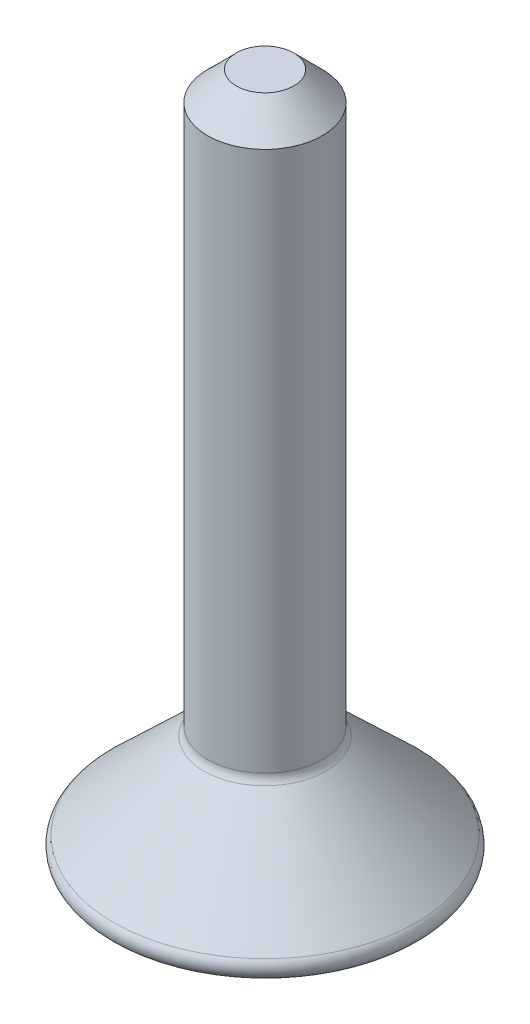
ISO-10303-21;
HEADER;
FILE_DESCRIPTION(('STEP AP214'),'2;1');
FILE_NAME('part.step','',(''),(''),'','','');
FILE_SCHEMA(('AUTOMOTIVE_DESIGN { 1 0 10303 214 1 1 1 1 }'));
ENDSEC;
DATA;
#1=APPLICATION_CONTEXT('core data for automotive mechanical design processes');
#2=APPLICATION_PROTOCOL_DEFINITION('international standard','automotive_design',2000,#1);
#3=PRODUCT_CONTEXT('',#1,'mechanical');
#4=PRODUCT('Part','Part','',(#3));
#5=PRODUCT_RELATED_PRODUCT_CATEGORY('part','',(#4));
#6=PRODUCT_DEFINITION_FORMATION('','',#4);
#7=PRODUCT_DEFINITION_CONTEXT('part definition',#1,'design');
#8=PRODUCT_DEFINITION('design','',#6,#7);
#9=PRODUCT_DEFINITION_SHAPE('','',#8);
#10=(LENGTH_UNIT() NAMED_UNIT(*) SI_UNIT(.MILLI.,.METRE.));
#11=(NAMED_UNIT(*) PLANE_ANGLE_UNIT() SI_UNIT($,.RADIAN.));
#12=(NAMED_UNIT(*) SI_UNIT($,.STERADIAN.) SOLID_ANGLE_UNIT());
#13=UNCERTAINTY_MEASURE_WITH_UNIT(LENGTH_MEASURE(1.E-05),#10,'distance_accuracy_value','');
#14=(GEOMETRIC_REPRESENTATION_CONTEXT(3) GLOBAL_UNCERTAINTY_ASSIGNED_CONTEXT((#13)) GLOBAL_UNIT_ASSIGNED_CONTEXT((#10,
#11,#12)) REPRESENTATION_CONTEXT('',''));
#15=CARTESIAN_POINT('',(0.,0.,0.));
#16=DIRECTION('',(0.,0.,1.));
#17=DIRECTION('',(1.,0.,0.));
#18=AXIS2_PLACEMENT_3D('',#15,#16,#17);
#19=CARTESIAN_POINT('',(0.,0.,0.));
#20=DIRECTION('',(0.,-1.,0.));
#21=DIRECTION('',(0.,0.,-1.));
#22=AXIS2_PLACEMENT_3D('',#19,#20,#21);
#23=CONICAL_SURFACE('',#22,3.,0.811033571919126);
#24=CARTESIAN_POINT('',(0.,1.84086239776379,0.));
#25=DIRECTION('',(0.,-1.,0.));
#26=DIRECTION('',(0.,0.,-1.));
#27=AXIS2_PLACEMENT_3D('',#24,#25,#26);
#28=CIRCLE('',#27,1.06225010761706);
#29=CARTESIAN_POINT('',(0.,1.84086239776379,-1.06225010761706));
#30=VERTEX_POINT('',#29);
#31=EDGE_CURVE('E56',#30,#30,#28,.T.);
#32=ORIENTED_EDGE('',*,*,#31,.T.);
#33=EDGE_LOOP('',(#32));
#34=FACE_BOUND('',#33,.T.);
#35=CARTESIAN_POINT('',(0.,0.344999886718883,0.));
#36=DIRECTION('',(0.,1.,0.));
#37=DIRECTION('',(0.,0.,1.));
#38=AXIS2_PLACEMENT_3D('',#35,#36,#37);
#39=CIRCLE('',#38,2.63684222450644);
#40=CARTESIAN_POINT('',(0.,0.344999886718883,2.63684222450644));
#41=VERTEX_POINT('',#40);
#42=EDGE_CURVE('E183',#41,#41,#39,.T.);
#43=ORIENTED_EDGE('',*,*,#42,.T.);
#44=EDGE_LOOP('',(#43));
#45=FACE_BOUND('',#44,.T.);
#46=ADVANCED_FACE('F47',(#34,#45),#23,.T.);
#47=CARTESIAN_POINT('',(3.,0.,0.));
#48=DIRECTION('',(0.,1.,0.));
#49=DIRECTION('',(0.,0.,1.));
#50=AXIS2_PLACEMENT_3D('',#47,#48,#49);
#51=PLANE('',#50);
#52=CARTESIAN_POINT('',(0.,0.,0.));
#53=DIRECTION('',(0.,1.,0.));
#54=DIRECTION('',(0.,0.,1.));
#55=AXIS2_PLACEMENT_3D('',#52,#53,#54);
#56=CIRCLE('',#55,2.4990923321235);
#57=CARTESIAN_POINT('',(0.,0.,2.4990923321235));
#58=VERTEX_POINT('',#57);
#59=EDGE_CURVE('E11',#58,#58,#56,.F.);
#60=ORIENTED_EDGE('',*,*,#59,.T.);
#61=EDGE_LOOP('',(#60));
#62=FACE_BOUND('',#61,.T.);
#63=DIRECTION('',(-0.866025403784439,0.,-0.5));
#64=VECTOR('',#63,1.);
#65=CARTESIAN_POINT('',(0.,0.,1.15470053837925));
#66=LINE('',#65,#64);
#67=CARTESIAN_POINT('',(0.,0.,1.15470053837925));
#68=VERTEX_POINT('',#67);
#69=CARTESIAN_POINT('',(-1.,0.,0.577350269189626));
#70=VERTEX_POINT('',#69);
#71=EDGE_CURVE('E143',#68,#70,#66,.T.);
#72=ORIENTED_EDGE('',*,*,#71,.F.);
#73=DIRECTION('',(-0.866025403784439,0.,0.5));
#74=VECTOR('',#73,1.);
#75=CARTESIAN_POINT('',(1.,0.,0.577350269189626));
#76=LINE('',#75,#74);
#77=CARTESIAN_POINT('',(1.,0.,0.577350269189626));
#78=VERTEX_POINT('',#77);
#79=EDGE_CURVE('E63',#78,#68,#76,.T.);
#80=ORIENTED_EDGE('',*,*,#79,.F.);
#81=DIRECTION('',(0.,0.,1.));
#82=VECTOR('',#81,1.);
#83=CARTESIAN_POINT('',(1.,0.,-0.577350269189626));
#84=LINE('',#83,#82);
#85=CARTESIAN_POINT('',(1.,0.,-0.577350269189626));
#86=VERTEX_POINT('',#85);
#87=EDGE_CURVE('E156',#86,#78,#84,.T.);
#88=ORIENTED_EDGE('',*,*,#87,.F.);
#89=DIRECTION('',(0.866025403784439,0.,0.5));
#90=VECTOR('',#89,1.);
#91=CARTESIAN_POINT('',(0.,0.,-1.15470053837925));
#92=LINE('',#91,#90);
#93=CARTESIAN_POINT('',(0.,0.,-1.15470053837925));
#94=VERTEX_POINT('',#93);
#95=EDGE_CURVE('E153',#94,#86,#92,.T.);
#96=ORIENTED_EDGE('',*,*,#95,.F.);
#97=DIRECTION('',(0.866025403784439,0.,-0.5));
#98=VECTOR('',#97,1.);
#99=CARTESIAN_POINT('',(-1.,0.,-0.577350269189626));
#100=LINE('',#99,#98);
#101=CARTESIAN_POINT('',(-1.,0.,-0.577350269189626));
#102=VERTEX_POINT('',#101);
#103=EDGE_CURVE('E111',#102,#94,#100,.T.);
#104=ORIENTED_EDGE('',*,*,#103,.F.);
#105=DIRECTION('',(0.,0.,-1.));
#106=VECTOR('',#105,1.);
#107=CARTESIAN_POINT('',(-1.,0.,0.577350269189626));
#108=LINE('',#107,#106);
#109=EDGE_CURVE('E147',#70,#102,#108,.T.);
#110=ORIENTED_EDGE('',*,*,#109,.F.);
#111=EDGE_LOOP('',(#72,#80,#88,#96,#104,#110));
#112=FACE_BOUND('',#111,.T.);
#113=ADVANCED_FACE('F202',(#62,#112),#51,.F.);
#114=CARTESIAN_POINT('',(0.,11.9,0.));
#115=DIRECTION('',(0.,-1.,0.));
#116=DIRECTION('',(0.,0.,-1.));
#117=AXIS2_PLACEMENT_3D('',#114,#115,#116);
#118=CYLINDRICAL_SURFACE('',#117,1.);
#119=CARTESIAN_POINT('',(0.,1.98586228448267,0.));
#120=DIRECTION('',(0.,1.,0.));
#121=DIRECTION('',(0.,0.,1.));
#122=AXIS2_PLACEMENT_3D('',#119,#120,#121);
#123=CIRCLE('',#122,1.);
#124=CARTESIAN_POINT('',(0.,1.98586228448267,1.));
#125=VERTEX_POINT('',#124);
#126=EDGE_CURVE('E179',#125,#125,#123,.T.);
#127=ORIENTED_EDGE('',*,*,#126,.T.);
#128=EDGE_LOOP('',(#127));
#129=FACE_BOUND('',#128,.T.);
#130=CARTESIAN_POINT('',(0.,11.4,0.));
#131=DIRECTION('',(0.,1.,0.));
#132=DIRECTION('',(0.,0.,1.));
#133=AXIS2_PLACEMENT_3D('',#130,#131,#132);
#134=CIRCLE('',#133,1.);
#135=CARTESIAN_POINT('',(0.,11.4,1.));
#136=VERTEX_POINT('',#135);
#137=EDGE_CURVE('E175',#136,#136,#134,.F.);
#138=ORIENTED_EDGE('',*,*,#137,.T.);
#139=EDGE_LOOP('',(#138));
#140=FACE_BOUND('',#139,.T.);
#141=ADVANCED_FACE('F198',(#129,#140),#118,.T.);
#142=CARTESIAN_POINT('',(0.,11.9,0.));
#143=DIRECTION('',(0.,1.,0.));
#144=DIRECTION('',(0.,0.,1.));
#145=AXIS2_PLACEMENT_3D('',#142,#143,#144);
#146=PLANE('',#145);
#147=CARTESIAN_POINT('',(0.,11.9,0.));
#148=DIRECTION('',(0.,1.,0.));
#149=DIRECTION('',(0.,0.,1.));
#150=AXIS2_PLACEMENT_3D('',#147,#148,#149);
#151=CIRCLE('',#150,0.5);
#152=CARTESIAN_POINT('',(0.,11.9,0.5));
#153=VERTEX_POINT('',#152);
#154=EDGE_CURVE('E162',#153,#153,#151,.T.);
#155=ORIENTED_EDGE('',*,*,#154,.T.);
#156=EDGE_LOOP('',(#155));
#157=FACE_BOUND('',#156,.T.);
#158=ADVANCED_FACE('F201',(#157),#146,.T.);
#159=CARTESIAN_POINT('',(1.,1.,0.577350269189626));
#160=DIRECTION('',(0.5,0.,0.866025403784439));
#161=DIRECTION('',(0.866025403784439,0.,-0.5));
#162=AXIS2_PLACEMENT_3D('',#159,#160,#161);
#163=PLANE('',#162);
#164=ORIENTED_EDGE('',*,*,#79,.T.);
#165=DIRECTION('',(0.,-1.,0.));
#166=VECTOR('',#165,1.);
#167=CARTESIAN_POINT('',(0.,1.,1.15470053837925));
#168=LINE('',#167,#166);
#169=CARTESIAN_POINT('',(0.,1.,1.15470053837925));
#170=VERTEX_POINT('',#169);
#171=EDGE_CURVE('E93',#170,#68,#168,.T.);
#172=ORIENTED_EDGE('',*,*,#171,.F.);
#173=DIRECTION('',(-0.866025403784439,0.,0.5));
#174=VECTOR('',#173,1.);
#175=CARTESIAN_POINT('',(1.,1.,0.577350269189626));
#176=LINE('',#175,#174);
#177=CARTESIAN_POINT('',(1.,1.,0.577350269189626));
#178=VERTEX_POINT('',#177);
#179=EDGE_CURVE('E159',#178,#170,#176,.T.);
#180=ORIENTED_EDGE('',*,*,#179,.F.);
#181=DIRECTION('',(0.,-1.,0.));
#182=VECTOR('',#181,1.);
#183=CARTESIAN_POINT('',(1.,1.,0.577350269189626));
#184=LINE('',#183,#182);
#185=EDGE_CURVE('E71',#178,#78,#184,.T.);
#186=ORIENTED_EDGE('',*,*,#185,.T.);
#187=EDGE_LOOP('',(#164,#172,#180,#186));
#188=FACE_BOUND('',#187,.T.);
#189=ADVANCED_FACE('F212',(#188),#163,.F.);
#190=CARTESIAN_POINT('',(1.,1.,-0.577350269189626));
#191=DIRECTION('',(1.,0.,0.));
#192=DIRECTION('',(0.,0.,-1.));
#193=AXIS2_PLACEMENT_3D('',#190,#191,#192);
#194=PLANE('',#193);
#195=ORIENTED_EDGE('',*,*,#87,.T.);
#196=ORIENTED_EDGE('',*,*,#185,.F.);
#197=DIRECTION('',(0.,0.,1.));
#198=VECTOR('',#197,1.);
#199=CARTESIAN_POINT('',(1.,1.,-0.577350269189626));
#200=LINE('',#199,#198);
#201=CARTESIAN_POINT('',(1.,1.,-0.577350269189626));
#202=VERTEX_POINT('',#201);
#203=EDGE_CURVE('E125',#202,#178,#200,.T.);
#204=ORIENTED_EDGE('',*,*,#203,.F.);
#205=DIRECTION('',(0.,-1.,0.));
#206=VECTOR('',#205,1.);
#207=CARTESIAN_POINT('',(1.,1.,-0.577350269189626));
#208=LINE('',#207,#206);
#209=EDGE_CURVE('E116',#202,#86,#208,.T.);
#210=ORIENTED_EDGE('',*,*,#209,.T.);
#211=EDGE_LOOP('',(#195,#196,#204,#210));
#212=FACE_BOUND('',#211,.T.);
#213=ADVANCED_FACE('F218',(#212),#194,.F.);
#214=CARTESIAN_POINT('',(0.,1.,-1.15470053837925));
#215=DIRECTION('',(0.5,0.,-0.866025403784439));
#216=DIRECTION('',(-0.866025403784439,0.,-0.5));
#217=AXIS2_PLACEMENT_3D('',#214,#215,#216);
#218=PLANE('',#217);
#219=ORIENTED_EDGE('',*,*,#95,.T.);
#220=ORIENTED_EDGE('',*,*,#209,.F.);
#221=DIRECTION('',(0.866025403784439,0.,0.5));
#222=VECTOR('',#221,1.);
#223=CARTESIAN_POINT('',(0.,1.,-1.15470053837925));
#224=LINE('',#223,#222);
#225=CARTESIAN_POINT('',(0.,1.,-1.15470053837925));
#226=VERTEX_POINT('',#225);
#227=EDGE_CURVE('E120',#226,#202,#224,.T.);
#228=ORIENTED_EDGE('',*,*,#227,.F.);
#229=DIRECTION('',(0.,-1.,0.));
#230=VECTOR('',#229,1.);
#231=CARTESIAN_POINT('',(0.,1.,-1.15470053837925));
#232=LINE('',#231,#230);
#233=EDGE_CURVE('E104',#226,#94,#232,.T.);
#234=ORIENTED_EDGE('',*,*,#233,.T.);
#235=EDGE_LOOP('',(#219,#220,#228,#234));
#236=FACE_BOUND('',#235,.T.);
#237=ADVANCED_FACE('F121',(#236),#218,.F.);
#238=CARTESIAN_POINT('',(-1.,1.,-0.577350269189626));
#239=DIRECTION('',(-0.5,0.,-0.866025403784439));
#240=DIRECTION('',(-0.866025403784439,0.,0.5));
#241=AXIS2_PLACEMENT_3D('',#238,#239,#240);
#242=PLANE('',#241);
#243=ORIENTED_EDGE('',*,*,#103,.T.);
#244=ORIENTED_EDGE('',*,*,#233,.F.);
#245=DIRECTION('',(0.866025403784439,0.,-0.5));
#246=VECTOR('',#245,1.);
#247=CARTESIAN_POINT('',(-1.,1.,-0.577350269189626));
#248=LINE('',#247,#246);
#249=CARTESIAN_POINT('',(-1.,1.,-0.577350269189626));
#250=VERTEX_POINT('',#249);
#251=EDGE_CURVE('E108',#250,#226,#248,.T.);
#252=ORIENTED_EDGE('',*,*,#251,.F.);
#253=DIRECTION('',(0.,-1.,0.));
#254=VECTOR('',#253,1.);
#255=CARTESIAN_POINT('',(-1.,1.,-0.577350269189626));
#256=LINE('',#255,#254);
#257=EDGE_CURVE('E117',#250,#102,#256,.T.);
#258=ORIENTED_EDGE('',*,*,#257,.T.);
#259=EDGE_LOOP('',(#243,#244,#252,#258));
#260=FACE_BOUND('',#259,.T.);
#261=ADVANCED_FACE('F106',(#260),#242,.F.);
#262=CARTESIAN_POINT('',(-1.,1.,0.577350269189626));
#263=DIRECTION('',(-1.,0.,0.));
#264=DIRECTION('',(0.,0.,1.));
#265=AXIS2_PLACEMENT_3D('',#262,#263,#264);
#266=PLANE('',#265);
#267=ORIENTED_EDGE('',*,*,#109,.T.);
#268=ORIENTED_EDGE('',*,*,#257,.F.);
#269=DIRECTION('',(0.,0.,-1.));
#270=VECTOR('',#269,1.);
#271=CARTESIAN_POINT('',(-1.,1.,0.577350269189626));
#272=LINE('',#271,#270);
#273=CARTESIAN_POINT('',(-1.,1.,0.577350269189626));
#274=VERTEX_POINT('',#273);
#275=EDGE_CURVE('E131',#274,#250,#272,.T.);
#276=ORIENTED_EDGE('',*,*,#275,.F.);
#277=DIRECTION('',(0.,-1.,0.));
#278=VECTOR('',#277,1.);
#279=CARTESIAN_POINT('',(-1.,1.,0.577350269189626));
#280=LINE('',#279,#278);
#281=EDGE_CURVE('E167',#274,#70,#280,.T.);
#282=ORIENTED_EDGE('',*,*,#281,.T.);
#283=EDGE_LOOP('',(#267,#268,#276,#282));
#284=FACE_BOUND('',#283,.T.);
#285=ADVANCED_FACE('F252',(#284),#266,.F.);
#286=CARTESIAN_POINT('',(0.,1.,1.15470053837925));
#287=DIRECTION('',(-0.5,0.,0.866025403784439));
#288=DIRECTION('',(0.866025403784439,0.,0.5));
#289=AXIS2_PLACEMENT_3D('',#286,#287,#288);
#290=PLANE('',#289);
#291=ORIENTED_EDGE('',*,*,#71,.T.);
#292=ORIENTED_EDGE('',*,*,#281,.F.);
#293=DIRECTION('',(-0.866025403784439,0.,-0.5));
#294=VECTOR('',#293,1.);
#295=CARTESIAN_POINT('',(0.,1.,1.15470053837925));
#296=LINE('',#295,#294);
#297=EDGE_CURVE('E135',#170,#274,#296,.T.);
#298=ORIENTED_EDGE('',*,*,#297,.F.);
#299=ORIENTED_EDGE('',*,*,#171,.T.);
#300=EDGE_LOOP('',(#291,#292,#298,#299));
#301=FACE_BOUND('',#300,.T.);
#302=ADVANCED_FACE('F238',(#301),#290,.F.);
#303=CARTESIAN_POINT('',(0.,1.,0.));
#304=DIRECTION('',(0.,-1.,0.));
#305=DIRECTION('',(0.,0.,-1.));
#306=AXIS2_PLACEMENT_3D('',#303,#304,#305);
#307=PLANE('',#306);
#308=ORIENTED_EDGE('',*,*,#179,.T.);
#309=ORIENTED_EDGE('',*,*,#297,.T.);
#310=ORIENTED_EDGE('',*,*,#275,.T.);
#311=ORIENTED_EDGE('',*,*,#251,.T.);
#312=ORIENTED_EDGE('',*,*,#227,.T.);
#313=ORIENTED_EDGE('',*,*,#203,.T.);
#314=EDGE_LOOP('',(#308,#309,#310,#311,#312,#313));
#315=FACE_BOUND('',#314,.T.);
#316=ADVANCED_FACE('F128',(#315),#307,.T.);
#317=CARTESIAN_POINT('',(0.,11.9,0.));
#318=DIRECTION('',(0.,-1.,0.));
#319=DIRECTION('',(0.,0.,-1.));
#320=AXIS2_PLACEMENT_3D('',#317,#318,#319);
#321=CONICAL_SURFACE('',#320,0.5,0.785398163397444);
#322=ORIENTED_EDGE('',*,*,#137,.F.);
#323=EDGE_LOOP('',(#322));
#324=FACE_BOUND('',#323,.T.);
#325=ORIENTED_EDGE('',*,*,#154,.F.);
#326=EDGE_LOOP('',(#325));
#327=FACE_BOUND('',#326,.T.);
#328=ADVANCED_FACE('F195',(#324,#327),#321,.T.);
#329=CARTESIAN_POINT('',(0.,1.98586228448267,0.));
#330=DIRECTION('',(0.,1.,0.));
#331=DIRECTION('',(0.,0.,1.));
#332=AXIS2_PLACEMENT_3D('',#329,#330,#331);
#333=TOROIDAL_SURFACE('',#332,1.2,0.2);
#334=ORIENTED_EDGE('',*,*,#31,.F.);
#335=EDGE_LOOP('',(#334));
#336=FACE_BOUND('',#335,.T.);
#337=ORIENTED_EDGE('',*,*,#126,.F.);
#338=EDGE_LOOP('',(#337));
#339=FACE_BOUND('',#338,.T.);
#340=ADVANCED_FACE('F192',(#336,#339),#333,.F.);
#341=CARTESIAN_POINT('',(0.,0.2,0.));
#342=DIRECTION('',(0.,1.,0.));
#343=DIRECTION('',(0.,0.,1.));
#344=AXIS2_PLACEMENT_3D('',#341,#342,#343);
#345=TOROIDAL_SURFACE('',#344,2.4990923321235,0.2);
#346=ORIENTED_EDGE('',*,*,#59,.F.);
#347=EDGE_LOOP('',(#346));
#348=FACE_BOUND('',#347,.T.);
#349=ORIENTED_EDGE('',*,*,#42,.F.);
#350=EDGE_LOOP('',(#349));
#351=FACE_BOUND('',#350,.T.);
#352=ADVANCED_FACE('F49',(#348,#351),#345,.T.);
#353=CLOSED_SHELL('',(#46,#113,#141,#158,#189,#213,#237,#261,#285,#302,#316,#328,#340,#352));
#354=MANIFOLD_SOLID_BREP('B2',#353);
#355=ADVANCED_BREP_SHAPE_REPRESENTATION('',(#18,#354),#14);
#356=SHAPE_DEFINITION_REPRESENTATION(#9,#355);
ENDSEC;
END-ISO-10303-21;
